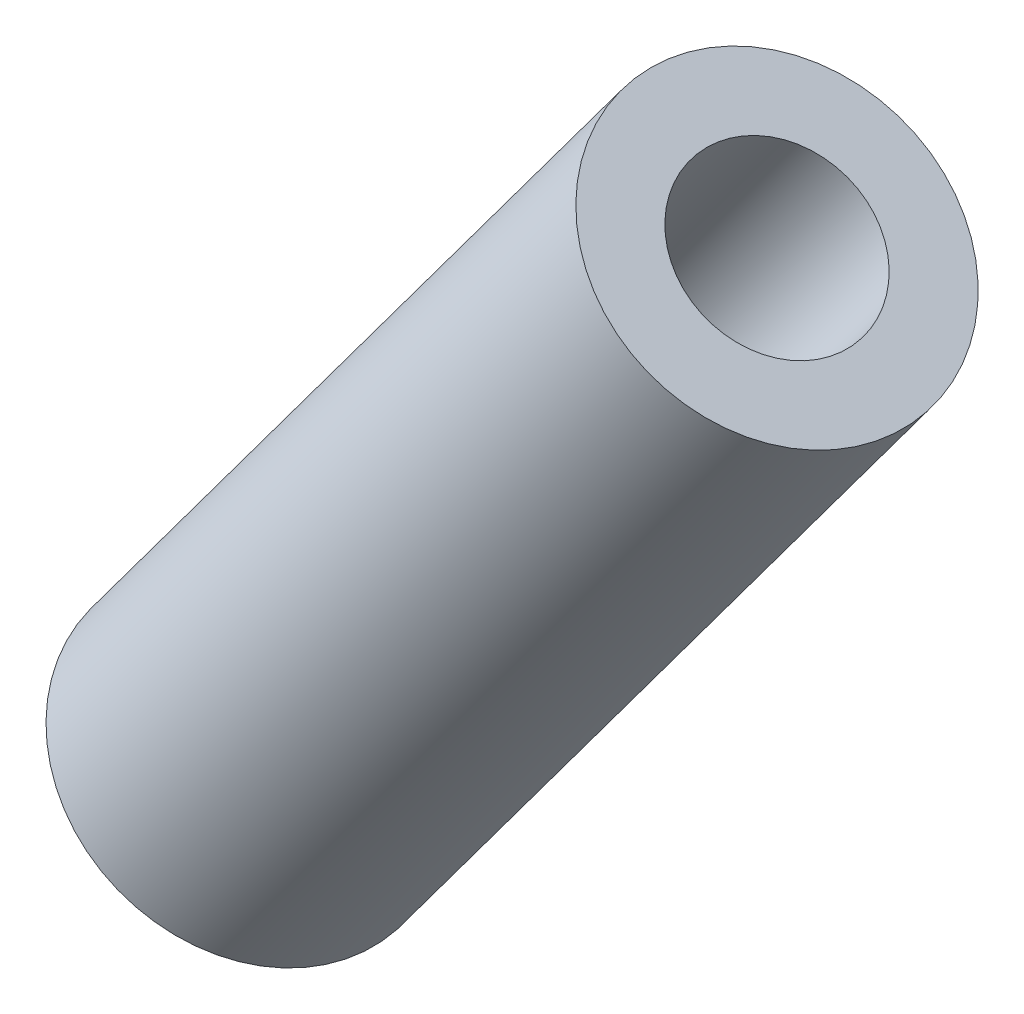
ISO-10303-21;
HEADER;
FILE_DESCRIPTION(('STEP AP214'),'2;1');
FILE_NAME('part.step','',(''),(''),'','','');
FILE_SCHEMA(('AUTOMOTIVE_DESIGN { 1 0 10303 214 1 1 1 1 }'));
ENDSEC;
DATA;
#1=APPLICATION_CONTEXT('core data for automotive mechanical design processes');
#2=APPLICATION_PROTOCOL_DEFINITION('international standard','automotive_design',2000,#1);
#3=PRODUCT_CONTEXT('',#1,'mechanical');
#4=PRODUCT('Part','Part','',(#3));
#5=PRODUCT_RELATED_PRODUCT_CATEGORY('part','',(#4));
#6=PRODUCT_DEFINITION_FORMATION('','',#4);
#7=PRODUCT_DEFINITION_CONTEXT('part definition',#1,'design');
#8=PRODUCT_DEFINITION('design','',#6,#7);
#9=PRODUCT_DEFINITION_SHAPE('','',#8);
#10=(LENGTH_UNIT() NAMED_UNIT(*) SI_UNIT(.MILLI.,.METRE.));
#11=(NAMED_UNIT(*) PLANE_ANGLE_UNIT() SI_UNIT($,.RADIAN.));
#12=(NAMED_UNIT(*) SI_UNIT($,.STERADIAN.) SOLID_ANGLE_UNIT());
#13=UNCERTAINTY_MEASURE_WITH_UNIT(LENGTH_MEASURE(1.E-05),#10,'distance_accuracy_value','');
#14=(GEOMETRIC_REPRESENTATION_CONTEXT(3) GLOBAL_UNCERTAINTY_ASSIGNED_CONTEXT((#13)) GLOBAL_UNIT_ASSIGNED_CONTEXT((#10,
#11,#12)) REPRESENTATION_CONTEXT('',''));
#15=CARTESIAN_POINT('',(0.,0.,0.));
#16=DIRECTION('',(0.,0.,1.));
#17=DIRECTION('',(1.,0.,0.));
#18=AXIS2_PLACEMENT_3D('',#15,#16,#17);
#19=CARTESIAN_POINT('',(0.,0.,0.));
#20=DIRECTION('',(0.596262476018023,0.802789548818902,0.));
#21=DIRECTION('',(-0.802789548818902,0.596262476018023,0.));
#22=AXIS2_PLACEMENT_3D('',#19,#20,#21);
#23=PLANE('',#22);
#24=CARTESIAN_POINT('',(0.,0.,0.));
#25=DIRECTION('',(0.596262476018023,0.802789548818902,0.));
#26=DIRECTION('',(-0.802789548818902,0.596262476018023,0.));
#27=AXIS2_PLACEMENT_3D('',#24,#25,#26);
#28=CIRCLE('',#27,5.);
#29=CARTESIAN_POINT('',(-4.01394774409451,2.98131238009012,0.));
#30=VERTEX_POINT('',#29);
#31=EDGE_CURVE('E65',#30,#30,#28,.F.);
#32=ORIENTED_EDGE('',*,*,#31,.F.);
#33=EDGE_LOOP('',(#32));
#34=FACE_BOUND('',#33,.T.);
#35=CARTESIAN_POINT('',(0.,0.,0.));
#36=DIRECTION('',(0.596262476018023,0.802789548818902,0.));
#37=DIRECTION('',(-0.802789548818902,0.596262476018023,0.));
#38=AXIS2_PLACEMENT_3D('',#35,#36,#37);
#39=CIRCLE('',#38,8.96875);
#40=CARTESIAN_POINT('',(-7.20001876596953,5.34772908178665,0.));
#41=VERTEX_POINT('',#40);
#42=EDGE_CURVE('E57',#41,#41,#39,.T.);
#43=ORIENTED_EDGE('',*,*,#42,.F.);
#44=EDGE_LOOP('',(#43));
#45=FACE_BOUND('',#44,.T.);
#46=ADVANCED_FACE('F51',(#34,#45),#23,.F.);
#47=CARTESIAN_POINT('',(30.2901337817156,40.7817090800002,0.));
#48=DIRECTION('',(0.596262476018023,0.802789548818902,0.));
#49=DIRECTION('',(-0.802789548818902,0.596262476018023,0.));
#50=AXIS2_PLACEMENT_3D('',#47,#48,#49);
#51=PLANE('',#50);
#52=CARTESIAN_POINT('',(30.2901337817156,40.7817090800002,0.));
#53=DIRECTION('',(0.596262476018023,0.802789548818902,0.));
#54=DIRECTION('',(-0.802789548818902,0.596262476018023,0.));
#55=AXIS2_PLACEMENT_3D('',#52,#53,#54);
#56=CIRCLE('',#55,5.);
#57=CARTESIAN_POINT('',(26.2761860376211,43.7630214600903,0.));
#58=VERTEX_POINT('',#57);
#59=EDGE_CURVE('E61',#58,#58,#56,.F.);
#60=ORIENTED_EDGE('',*,*,#59,.T.);
#61=EDGE_LOOP('',(#60));
#62=FACE_BOUND('',#61,.T.);
#63=CARTESIAN_POINT('',(30.2901337817156,40.7817090800002,0.));
#64=DIRECTION('',(0.596262476018023,0.802789548818902,0.));
#65=DIRECTION('',(-0.802789548818902,0.596262476018023,0.));
#66=AXIS2_PLACEMENT_3D('',#63,#64,#65);
#67=CIRCLE('',#66,8.96875);
#68=CARTESIAN_POINT('',(23.0901150157461,46.1294381617869,0.));
#69=VERTEX_POINT('',#68);
#70=EDGE_CURVE('E11',#69,#69,#67,.T.);
#71=ORIENTED_EDGE('',*,*,#70,.T.);
#72=EDGE_LOOP('',(#71));
#73=FACE_BOUND('',#72,.T.);
#74=ADVANCED_FACE('F76',(#62,#73),#51,.T.);
#75=CARTESIAN_POINT('',(0.,0.,0.));
#76=DIRECTION('',(0.596262476018023,0.802789548818902,0.));
#77=DIRECTION('',(-0.802789548818902,0.596262476018023,0.));
#78=AXIS2_PLACEMENT_3D('',#75,#76,#77);
#79=CYLINDRICAL_SURFACE('',#78,8.96875);
#80=ORIENTED_EDGE('',*,*,#70,.F.);
#81=EDGE_LOOP('',(#80));
#82=FACE_BOUND('',#81,.T.);
#83=ORIENTED_EDGE('',*,*,#42,.T.);
#84=EDGE_LOOP('',(#83));
#85=FACE_BOUND('',#84,.T.);
#86=ADVANCED_FACE('F81',(#82,#85),#79,.T.);
#87=CARTESIAN_POINT('',(-0.596262476018023,-0.802789548818902,0.));
#88=DIRECTION('',(0.596262476018023,0.802789548818902,0.));
#89=DIRECTION('',(-0.802789548818902,0.596262476018023,0.));
#90=AXIS2_PLACEMENT_3D('',#87,#88,#89);
#91=CYLINDRICAL_SURFACE('',#90,5.);
#92=ORIENTED_EDGE('',*,*,#31,.T.);
#93=EDGE_LOOP('',(#92));
#94=FACE_BOUND('',#93,.T.);
#95=ORIENTED_EDGE('',*,*,#59,.F.);
#96=EDGE_LOOP('',(#95));
#97=FACE_BOUND('',#96,.T.);
#98=ADVANCED_FACE('F71',(#94,#97),#91,.F.);
#99=CLOSED_SHELL('',(#46,#74,#86,#98));
#100=MANIFOLD_SOLID_BREP('B2',#99);
#101=ADVANCED_BREP_SHAPE_REPRESENTATION('',(#18,#100),#14);
#102=SHAPE_DEFINITION_REPRESENTATION(#9,#101);
ENDSEC;
END-ISO-10303-21;
